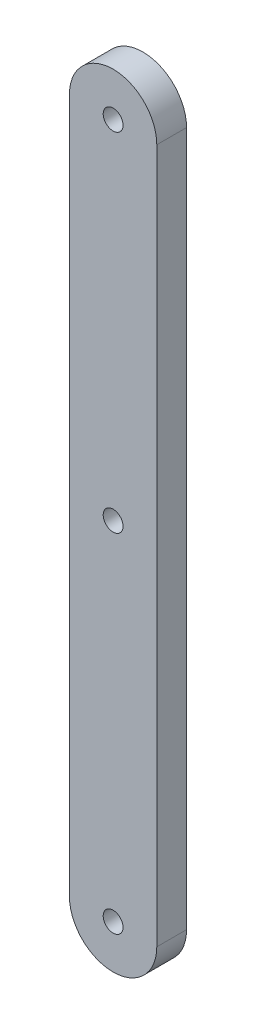
ISO-10303-21;
HEADER;
FILE_DESCRIPTION(('STEP AP214'),'2;1');
FILE_NAME('part.step','',(''),(''),'','','');
FILE_SCHEMA(('AUTOMOTIVE_DESIGN { 1 0 10303 214 1 1 1 1 }'));
ENDSEC;
DATA;
#1=APPLICATION_CONTEXT('core data for automotive mechanical design processes');
#2=APPLICATION_PROTOCOL_DEFINITION('international standard','automotive_design',2000,#1);
#3=PRODUCT_CONTEXT('',#1,'mechanical');
#4=PRODUCT('Part','Part','',(#3));
#5=PRODUCT_RELATED_PRODUCT_CATEGORY('part','',(#4));
#6=PRODUCT_DEFINITION_FORMATION('','',#4);
#7=PRODUCT_DEFINITION_CONTEXT('part definition',#1,'design');
#8=PRODUCT_DEFINITION('design','',#6,#7);
#9=PRODUCT_DEFINITION_SHAPE('','',#8);
#10=(LENGTH_UNIT() NAMED_UNIT(*) SI_UNIT(.MILLI.,.METRE.));
#11=(NAMED_UNIT(*) PLANE_ANGLE_UNIT() SI_UNIT($,.RADIAN.));
#12=(NAMED_UNIT(*) SI_UNIT($,.STERADIAN.) SOLID_ANGLE_UNIT());
#13=UNCERTAINTY_MEASURE_WITH_UNIT(LENGTH_MEASURE(1.E-05),#10,'distance_accuracy_value','');
#14=(GEOMETRIC_REPRESENTATION_CONTEXT(3) GLOBAL_UNCERTAINTY_ASSIGNED_CONTEXT((#13)) GLOBAL_UNIT_ASSIGNED_CONTEXT((#10,
#11,#12)) REPRESENTATION_CONTEXT('',''));
#15=CARTESIAN_POINT('',(0.,0.,0.));
#16=DIRECTION('',(0.,0.,1.));
#17=DIRECTION('',(1.,0.,0.));
#18=AXIS2_PLACEMENT_3D('',#15,#16,#17);
#19=CARTESIAN_POINT('',(0.,35.,3.));
#20=DIRECTION('',(0.,0.,-1.));
#21=DIRECTION('',(-1.,0.,0.));
#22=AXIS2_PLACEMENT_3D('',#19,#20,#21);
#23=CYLINDRICAL_SURFACE('',#22,4.4);
#24=CARTESIAN_POINT('',(0.,35.,0.));
#25=DIRECTION('',(0.,0.,1.));
#26=DIRECTION('',(1.,0.,0.));
#27=AXIS2_PLACEMENT_3D('',#24,#25,#26);
#28=CIRCLE('',#27,4.4);
#29=CARTESIAN_POINT('',(4.39999999999999,35.,0.));
#30=VERTEX_POINT('',#29);
#31=CARTESIAN_POINT('',(-4.40000000000001,35.,0.));
#32=VERTEX_POINT('',#31);
#33=EDGE_CURVE('E129',#30,#32,#28,.T.);
#34=ORIENTED_EDGE('',*,*,#33,.T.);
#35=DIRECTION('',(0.,0.,-1.));
#36=VECTOR('',#35,1.);
#37=CARTESIAN_POINT('',(-4.40000000000001,35.,3.));
#38=LINE('',#37,#36);
#39=CARTESIAN_POINT('',(-4.40000000000001,35.,3.));
#40=VERTEX_POINT('',#39);
#41=EDGE_CURVE('E110',#40,#32,#38,.T.);
#42=ORIENTED_EDGE('',*,*,#41,.F.);
#43=CARTESIAN_POINT('',(0.,35.,3.));
#44=DIRECTION('',(0.,0.,1.));
#45=DIRECTION('',(1.,0.,0.));
#46=AXIS2_PLACEMENT_3D('',#43,#44,#45);
#47=CIRCLE('',#46,4.4);
#48=CARTESIAN_POINT('',(4.39999999999999,35.,3.));
#49=VERTEX_POINT('',#48);
#50=EDGE_CURVE('E97',#49,#40,#47,.T.);
#51=ORIENTED_EDGE('',*,*,#50,.F.);
#52=DIRECTION('',(0.,0.,-1.));
#53=VECTOR('',#52,1.);
#54=CARTESIAN_POINT('',(4.39999999999999,35.,3.));
#55=LINE('',#54,#53);
#56=EDGE_CURVE('E128',#49,#30,#55,.T.);
#57=ORIENTED_EDGE('',*,*,#56,.T.);
#58=EDGE_LOOP('',(#34,#42,#51,#57));
#59=FACE_BOUND('',#58,.T.);
#60=ADVANCED_FACE('F51',(#59),#23,.T.);
#61=CARTESIAN_POINT('',(-4.40000000000001,0.,3.));
#62=DIRECTION('',(-1.,0.,0.));
#63=DIRECTION('',(0.,-1.,0.));
#64=AXIS2_PLACEMENT_3D('',#61,#62,#63);
#65=PLANE('',#64);
#66=DIRECTION('',(0.,1.,0.));
#67=VECTOR('',#66,1.);
#68=CARTESIAN_POINT('',(-4.40000000000001,0.,0.));
#69=LINE('',#68,#67);
#70=CARTESIAN_POINT('',(-4.4,-35.,0.));
#71=VERTEX_POINT('',#70);
#72=EDGE_CURVE('E108',#71,#32,#69,.T.);
#73=ORIENTED_EDGE('',*,*,#72,.F.);
#74=DIRECTION('',(0.,0.,-1.));
#75=VECTOR('',#74,1.);
#76=CARTESIAN_POINT('',(-4.4,-35.,3.));
#77=LINE('',#76,#75);
#78=CARTESIAN_POINT('',(-4.4,-35.,3.));
#79=VERTEX_POINT('',#78);
#80=EDGE_CURVE('E103',#79,#71,#77,.T.);
#81=ORIENTED_EDGE('',*,*,#80,.F.);
#82=DIRECTION('',(0.,1.,0.));
#83=VECTOR('',#82,1.);
#84=CARTESIAN_POINT('',(-4.40000000000001,0.,3.));
#85=LINE('',#84,#83);
#86=EDGE_CURVE('E106',#79,#40,#85,.T.);
#87=ORIENTED_EDGE('',*,*,#86,.T.);
#88=ORIENTED_EDGE('',*,*,#41,.T.);
#89=EDGE_LOOP('',(#73,#81,#87,#88));
#90=FACE_BOUND('',#89,.T.);
#91=ADVANCED_FACE('F105',(#90),#65,.T.);
#92=CARTESIAN_POINT('',(0.,-35.,3.));
#93=DIRECTION('',(0.,0.,-1.));
#94=DIRECTION('',(-1.,0.,0.));
#95=AXIS2_PLACEMENT_3D('',#92,#93,#94);
#96=CYLINDRICAL_SURFACE('',#95,4.4);
#97=CARTESIAN_POINT('',(0.,-35.,0.));
#98=DIRECTION('',(0.,0.,1.));
#99=DIRECTION('',(1.,0.,0.));
#100=AXIS2_PLACEMENT_3D('',#97,#98,#99);
#101=CIRCLE('',#100,4.4);
#102=CARTESIAN_POINT('',(4.4,-35.,0.));
#103=VERTEX_POINT('',#102);
#104=EDGE_CURVE('E86',#71,#103,#101,.T.);
#105=ORIENTED_EDGE('',*,*,#104,.T.);
#106=DIRECTION('',(0.,0.,-1.));
#107=VECTOR('',#106,1.);
#108=CARTESIAN_POINT('',(4.4,-35.,3.));
#109=LINE('',#108,#107);
#110=CARTESIAN_POINT('',(4.4,-35.,3.));
#111=VERTEX_POINT('',#110);
#112=EDGE_CURVE('E111',#111,#103,#109,.T.);
#113=ORIENTED_EDGE('',*,*,#112,.F.);
#114=CARTESIAN_POINT('',(0.,-35.,3.));
#115=DIRECTION('',(0.,0.,1.));
#116=DIRECTION('',(1.,0.,0.));
#117=AXIS2_PLACEMENT_3D('',#114,#115,#116);
#118=CIRCLE('',#117,4.4);
#119=EDGE_CURVE('E113',#79,#111,#118,.T.);
#120=ORIENTED_EDGE('',*,*,#119,.F.);
#121=ORIENTED_EDGE('',*,*,#80,.T.);
#122=EDGE_LOOP('',(#105,#113,#120,#121));
#123=FACE_BOUND('',#122,.T.);
#124=ADVANCED_FACE('F114',(#123),#96,.T.);
#125=CARTESIAN_POINT('',(4.39999999999999,0.,3.));
#126=DIRECTION('',(-1.,0.,0.));
#127=DIRECTION('',(0.,-1.,0.));
#128=AXIS2_PLACEMENT_3D('',#125,#126,#127);
#129=PLANE('',#128);
#130=DIRECTION('',(0.,1.,0.));
#131=VECTOR('',#130,1.);
#132=CARTESIAN_POINT('',(4.39999999999999,0.,0.));
#133=LINE('',#132,#131);
#134=EDGE_CURVE('E92',#103,#30,#133,.T.);
#135=ORIENTED_EDGE('',*,*,#134,.T.);
#136=ORIENTED_EDGE('',*,*,#56,.F.);
#137=DIRECTION('',(0.,1.,0.));
#138=VECTOR('',#137,1.);
#139=CARTESIAN_POINT('',(4.39999999999999,0.,3.));
#140=LINE('',#139,#138);
#141=EDGE_CURVE('E70',#111,#49,#140,.T.);
#142=ORIENTED_EDGE('',*,*,#141,.F.);
#143=ORIENTED_EDGE('',*,*,#112,.T.);
#144=EDGE_LOOP('',(#135,#136,#142,#143));
#145=FACE_BOUND('',#144,.T.);
#146=ADVANCED_FACE('F183',(#145),#129,.F.);
#147=CARTESIAN_POINT('',(0.,0.,3.));
#148=DIRECTION('',(0.,0.,1.));
#149=DIRECTION('',(1.,0.,0.));
#150=AXIS2_PLACEMENT_3D('',#147,#148,#149);
#151=PLANE('',#150);
#152=CARTESIAN_POINT('',(0.,35.,3.));
#153=DIRECTION('',(0.,0.,1.));
#154=DIRECTION('',(1.,0.,0.));
#155=AXIS2_PLACEMENT_3D('',#152,#153,#154);
#156=CIRCLE('',#155,1.);
#157=CARTESIAN_POINT('',(0.999999999999987,35.,3.));
#158=VERTEX_POINT('',#157);
#159=EDGE_CURVE('E133',#158,#158,#156,.T.);
#160=ORIENTED_EDGE('',*,*,#159,.F.);
#161=EDGE_LOOP('',(#160));
#162=FACE_BOUND('',#161,.T.);
#163=CARTESIAN_POINT('',(0.,-35.,3.));
#164=DIRECTION('',(0.,0.,1.));
#165=DIRECTION('',(1.,0.,0.));
#166=AXIS2_PLACEMENT_3D('',#163,#164,#165);
#167=CIRCLE('',#166,1.);
#168=CARTESIAN_POINT('',(1.,-35.,3.));
#169=VERTEX_POINT('',#168);
#170=EDGE_CURVE('E224',#169,#169,#167,.T.);
#171=ORIENTED_EDGE('',*,*,#170,.F.);
#172=EDGE_LOOP('',(#171));
#173=FACE_BOUND('',#172,.T.);
#174=CARTESIAN_POINT('',(0.,0.,3.));
#175=DIRECTION('',(0.,0.,1.));
#176=DIRECTION('',(1.,0.,0.));
#177=AXIS2_PLACEMENT_3D('',#174,#175,#176);
#178=CIRCLE('',#177,1.);
#179=CARTESIAN_POINT('',(1.,0.,3.));
#180=VERTEX_POINT('',#179);
#181=EDGE_CURVE('E221',#180,#180,#178,.T.);
#182=ORIENTED_EDGE('',*,*,#181,.F.);
#183=EDGE_LOOP('',(#182));
#184=FACE_BOUND('',#183,.T.);
#185=ORIENTED_EDGE('',*,*,#50,.T.);
#186=ORIENTED_EDGE('',*,*,#86,.F.);
#187=ORIENTED_EDGE('',*,*,#119,.T.);
#188=ORIENTED_EDGE('',*,*,#141,.T.);
#189=EDGE_LOOP('',(#185,#186,#187,#188));
#190=FACE_BOUND('',#189,.T.);
#191=ADVANCED_FACE('F117',(#162,#173,#184,#190),#151,.T.);
#192=CARTESIAN_POINT('',(0.,0.,0.));
#193=DIRECTION('',(0.,0.,1.));
#194=DIRECTION('',(1.,0.,0.));
#195=AXIS2_PLACEMENT_3D('',#192,#193,#194);
#196=PLANE('',#195);
#197=CARTESIAN_POINT('',(0.,0.,0.));
#198=DIRECTION('',(0.,0.,1.));
#199=DIRECTION('',(1.,0.,0.));
#200=AXIS2_PLACEMENT_3D('',#197,#198,#199);
#201=CIRCLE('',#200,2.24999999999998);
#202=CARTESIAN_POINT('',(2.24999999999998,0.,0.));
#203=VERTEX_POINT('',#202);
#204=EDGE_CURVE('E152',#203,#203,#201,.T.);
#205=ORIENTED_EDGE('',*,*,#204,.T.);
#206=EDGE_LOOP('',(#205));
#207=FACE_BOUND('',#206,.T.);
#208=CARTESIAN_POINT('',(0.,35.,0.));
#209=DIRECTION('',(0.,0.,1.));
#210=DIRECTION('',(1.,0.,0.));
#211=AXIS2_PLACEMENT_3D('',#208,#209,#210);
#212=CIRCLE('',#211,2.24999999999998);
#213=CARTESIAN_POINT('',(2.24999999999997,35.,0.));
#214=VERTEX_POINT('',#213);
#215=EDGE_CURVE('E148',#214,#214,#212,.T.);
#216=ORIENTED_EDGE('',*,*,#215,.T.);
#217=EDGE_LOOP('',(#216));
#218=FACE_BOUND('',#217,.T.);
#219=CARTESIAN_POINT('',(0.,-35.,0.));
#220=DIRECTION('',(0.,0.,1.));
#221=DIRECTION('',(1.,0.,0.));
#222=AXIS2_PLACEMENT_3D('',#219,#220,#221);
#223=CIRCLE('',#222,2.25);
#224=CARTESIAN_POINT('',(2.25,-35.,0.));
#225=VERTEX_POINT('',#224);
#226=EDGE_CURVE('E145',#225,#225,#223,.T.);
#227=ORIENTED_EDGE('',*,*,#226,.T.);
#228=EDGE_LOOP('',(#227));
#229=FACE_BOUND('',#228,.T.);
#230=ORIENTED_EDGE('',*,*,#33,.F.);
#231=ORIENTED_EDGE('',*,*,#134,.F.);
#232=ORIENTED_EDGE('',*,*,#104,.F.);
#233=ORIENTED_EDGE('',*,*,#72,.T.);
#234=EDGE_LOOP('',(#230,#231,#232,#233));
#235=FACE_BOUND('',#234,.T.);
#236=ADVANCED_FACE('F173',(#207,#218,#229,#235),#196,.F.);
#237=CARTESIAN_POINT('',(0.,0.,0.));
#238=DIRECTION('',(0.,0.,1.));
#239=DIRECTION('',(1.,0.,0.));
#240=AXIS2_PLACEMENT_3D('',#237,#238,#239);
#241=CYLINDRICAL_SURFACE('',#240,1.);
#242=CARTESIAN_POINT('',(0.,0.,1.24999999999998));
#243=DIRECTION('',(0.,0.,1.));
#244=DIRECTION('',(1.,0.,0.));
#245=AXIS2_PLACEMENT_3D('',#242,#243,#244);
#246=CIRCLE('',#245,1.);
#247=CARTESIAN_POINT('',(1.,0.,1.24999999999998));
#248=VERTEX_POINT('',#247);
#249=EDGE_CURVE('E156',#248,#248,#246,.F.);
#250=ORIENTED_EDGE('',*,*,#249,.T.);
#251=EDGE_LOOP('',(#250));
#252=FACE_BOUND('',#251,.T.);
#253=ORIENTED_EDGE('',*,*,#181,.T.);
#254=EDGE_LOOP('',(#253));
#255=FACE_BOUND('',#254,.T.);
#256=ADVANCED_FACE('F176',(#252,#255),#241,.F.);
#257=CARTESIAN_POINT('',(0.,-35.,0.));
#258=DIRECTION('',(0.,0.,1.));
#259=DIRECTION('',(1.,0.,0.));
#260=AXIS2_PLACEMENT_3D('',#257,#258,#259);
#261=CYLINDRICAL_SURFACE('',#260,1.);
#262=CARTESIAN_POINT('',(0.,-35.,1.25));
#263=DIRECTION('',(0.,0.,1.));
#264=DIRECTION('',(1.,0.,0.));
#265=AXIS2_PLACEMENT_3D('',#262,#263,#264);
#266=CIRCLE('',#265,1.);
#267=CARTESIAN_POINT('',(1.,-35.,1.25));
#268=VERTEX_POINT('',#267);
#269=EDGE_CURVE('E11',#268,#268,#266,.F.);
#270=ORIENTED_EDGE('',*,*,#269,.T.);
#271=EDGE_LOOP('',(#270));
#272=FACE_BOUND('',#271,.T.);
#273=ORIENTED_EDGE('',*,*,#170,.T.);
#274=EDGE_LOOP('',(#273));
#275=FACE_BOUND('',#274,.T.);
#276=ADVANCED_FACE('F210',(#272,#275),#261,.F.);
#277=CARTESIAN_POINT('',(0.,35.,0.));
#278=DIRECTION('',(0.,0.,1.));
#279=DIRECTION('',(1.,0.,0.));
#280=AXIS2_PLACEMENT_3D('',#277,#278,#279);
#281=CYLINDRICAL_SURFACE('',#280,1.);
#282=CARTESIAN_POINT('',(0.,35.,1.24999999999998));
#283=DIRECTION('',(0.,0.,1.));
#284=DIRECTION('',(1.,0.,0.));
#285=AXIS2_PLACEMENT_3D('',#282,#283,#284);
#286=CIRCLE('',#285,1.);
#287=CARTESIAN_POINT('',(0.999999999999987,35.,1.24999999999998));
#288=VERTEX_POINT('',#287);
#289=EDGE_CURVE('E62',#288,#288,#286,.F.);
#290=ORIENTED_EDGE('',*,*,#289,.T.);
#291=EDGE_LOOP('',(#290));
#292=FACE_BOUND('',#291,.T.);
#293=ORIENTED_EDGE('',*,*,#159,.T.);
#294=EDGE_LOOP('',(#293));
#295=FACE_BOUND('',#294,.T.);
#296=ADVANCED_FACE('F164',(#292,#295),#281,.F.);
#297=CARTESIAN_POINT('',(0.,0.,0.));
#298=DIRECTION('',(0.,0.,-1.));
#299=DIRECTION('',(-1.,0.,0.));
#300=AXIS2_PLACEMENT_3D('',#297,#298,#299);
#301=CONICAL_SURFACE('',#300,2.24999999999998,0.78539816339745);
#302=ORIENTED_EDGE('',*,*,#249,.F.);
#303=EDGE_LOOP('',(#302));
#304=FACE_BOUND('',#303,.T.);
#305=ORIENTED_EDGE('',*,*,#204,.F.);
#306=EDGE_LOOP('',(#305));
#307=FACE_BOUND('',#306,.T.);
#308=ADVANCED_FACE('F170',(#304,#307),#301,.F.);
#309=CARTESIAN_POINT('',(0.,35.,0.));
#310=DIRECTION('',(0.,0.,-1.));
#311=DIRECTION('',(-1.,0.,0.));
#312=AXIS2_PLACEMENT_3D('',#309,#310,#311);
#313=CONICAL_SURFACE('',#312,2.24999999999998,0.78539816339745);
#314=ORIENTED_EDGE('',*,*,#289,.F.);
#315=EDGE_LOOP('',(#314));
#316=FACE_BOUND('',#315,.T.);
#317=ORIENTED_EDGE('',*,*,#215,.F.);
#318=EDGE_LOOP('',(#317));
#319=FACE_BOUND('',#318,.T.);
#320=ADVANCED_FACE('F167',(#316,#319),#313,.F.);
#321=CARTESIAN_POINT('',(0.,-35.,0.));
#322=DIRECTION('',(0.,0.,-1.));
#323=DIRECTION('',(-1.,0.,0.));
#324=AXIS2_PLACEMENT_3D('',#321,#322,#323);
#325=CONICAL_SURFACE('',#324,2.25,0.78539816339745);
#326=ORIENTED_EDGE('',*,*,#269,.F.);
#327=EDGE_LOOP('',(#326));
#328=FACE_BOUND('',#327,.T.);
#329=ORIENTED_EDGE('',*,*,#226,.F.);
#330=EDGE_LOOP('',(#329));
#331=FACE_BOUND('',#330,.T.);
#332=ADVANCED_FACE('F54',(#328,#331),#325,.F.);
#333=CLOSED_SHELL('',(#60,#91,#124,#146,#191,#236,#256,#276,#296,#308,#320,#332));
#334=MANIFOLD_SOLID_BREP('B2',#333);
#335=ADVANCED_BREP_SHAPE_REPRESENTATION('',(#18,#334),#14);
#336=SHAPE_DEFINITION_REPRESENTATION(#9,#335);
ENDSEC;
END-ISO-10303-21;
